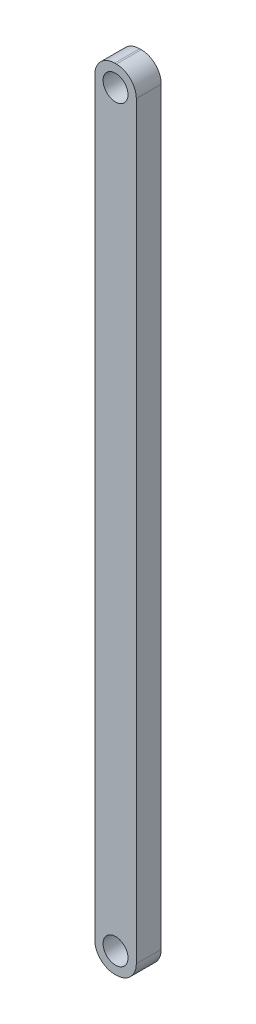
ISO-10303-21;
HEADER;
FILE_DESCRIPTION(('STEP AP214'),'2;1');
FILE_NAME('part.step','',(''),(''),'','','');
FILE_SCHEMA(('AUTOMOTIVE_DESIGN { 1 0 10303 214 1 1 1 1 }'));
ENDSEC;
DATA;
#1=APPLICATION_CONTEXT('core data for automotive mechanical design processes');
#2=APPLICATION_PROTOCOL_DEFINITION('international standard','automotive_design',2000,#1);
#3=PRODUCT_CONTEXT('',#1,'mechanical');
#4=PRODUCT('Part','Part','',(#3));
#5=PRODUCT_RELATED_PRODUCT_CATEGORY('part','',(#4));
#6=PRODUCT_DEFINITION_FORMATION('','',#4);
#7=PRODUCT_DEFINITION_CONTEXT('part definition',#1,'design');
#8=PRODUCT_DEFINITION('design','',#6,#7);
#9=PRODUCT_DEFINITION_SHAPE('','',#8);
#10=(LENGTH_UNIT() NAMED_UNIT(*) SI_UNIT(.MILLI.,.METRE.));
#11=(NAMED_UNIT(*) PLANE_ANGLE_UNIT() SI_UNIT($,.RADIAN.));
#12=(NAMED_UNIT(*) SI_UNIT($,.STERADIAN.) SOLID_ANGLE_UNIT());
#13=UNCERTAINTY_MEASURE_WITH_UNIT(LENGTH_MEASURE(1.E-05),#10,'distance_accuracy_value','');
#14=(GEOMETRIC_REPRESENTATION_CONTEXT(3) GLOBAL_UNCERTAINTY_ASSIGNED_CONTEXT((#13)) GLOBAL_UNIT_ASSIGNED_CONTEXT((#10,
#11,#12)) REPRESENTATION_CONTEXT('',''));
#15=CARTESIAN_POINT('',(0.,0.,0.));
#16=DIRECTION('',(0.,0.,1.));
#17=DIRECTION('',(1.,0.,0.));
#18=AXIS2_PLACEMENT_3D('',#15,#16,#17);
#19=CARTESIAN_POINT('',(0.,120.65,3.81));
#20=DIRECTION('',(1.,0.,0.));
#21=DIRECTION('',(0.,1.,0.));
#22=AXIS2_PLACEMENT_3D('',#19,#20,#21);
#23=PLANE('',#22);
#24=DIRECTION('',(0.,-1.,0.));
#25=VECTOR('',#24,1.);
#26=CARTESIAN_POINT('',(0.,120.65,0.));
#27=LINE('',#26,#25);
#28=CARTESIAN_POINT('',(0.,117.602,0.));
#29=VERTEX_POINT('',#28);
#30=CARTESIAN_POINT('',(0.,3.04800000000002,0.));
#31=VERTEX_POINT('',#30);
#32=EDGE_CURVE('E190',#29,#31,#27,.T.);
#33=ORIENTED_EDGE('',*,*,#32,.T.);
#34=DIRECTION('',(0.,0.,-1.));
#35=VECTOR('',#34,1.);
#36=CARTESIAN_POINT('',(0.,3.048,3.81));
#37=LINE('',#36,#35);
#38=CARTESIAN_POINT('',(0.,3.04800000000002,3.81));
#39=VERTEX_POINT('',#38);
#40=EDGE_CURVE('E48',#31,#39,#37,.F.);
#41=ORIENTED_EDGE('',*,*,#40,.T.);
#42=DIRECTION('',(0.,-1.,0.));
#43=VECTOR('',#42,1.);
#44=CARTESIAN_POINT('',(0.,120.65,3.81));
#45=LINE('',#44,#43);
#46=CARTESIAN_POINT('',(0.,117.602,3.81));
#47=VERTEX_POINT('',#46);
#48=EDGE_CURVE('E130',#47,#39,#45,.T.);
#49=ORIENTED_EDGE('',*,*,#48,.F.);
#50=DIRECTION('',(0.,0.,-1.));
#51=VECTOR('',#50,1.);
#52=CARTESIAN_POINT('',(0.,117.602,3.81));
#53=LINE('',#52,#51);
#54=EDGE_CURVE('E146',#47,#29,#53,.T.);
#55=ORIENTED_EDGE('',*,*,#54,.T.);
#56=EDGE_LOOP('',(#33,#41,#49,#55));
#57=FACE_BOUND('',#56,.T.);
#58=ADVANCED_FACE('F39',(#57),#23,.F.);
#59=CARTESIAN_POINT('',(0.,0.,3.81));
#60=DIRECTION('',(0.,1.,0.));
#61=DIRECTION('',(0.,0.,1.));
#62=AXIS2_PLACEMENT_3D('',#59,#60,#61);
#63=PLANE('',#62);
#64=DIRECTION('',(1.,0.,0.));
#65=VECTOR('',#64,1.);
#66=CARTESIAN_POINT('',(0.,0.,3.81));
#67=LINE('',#66,#65);
#68=CARTESIAN_POINT('',(3.048,0.,3.81));
#69=VERTEX_POINT('',#68);
#70=CARTESIAN_POINT('',(3.30199999999999,0.,3.81));
#71=VERTEX_POINT('',#70);
#72=EDGE_CURVE('E135',#69,#71,#67,.T.);
#73=ORIENTED_EDGE('',*,*,#72,.F.);
#74=DIRECTION('',(0.,0.,-1.));
#75=VECTOR('',#74,1.);
#76=CARTESIAN_POINT('',(3.048,0.,3.81));
#77=LINE('',#76,#75);
#78=CARTESIAN_POINT('',(3.048,0.,0.));
#79=VERTEX_POINT('',#78);
#80=EDGE_CURVE('E173',#69,#79,#77,.T.);
#81=ORIENTED_EDGE('',*,*,#80,.T.);
#82=DIRECTION('',(1.,0.,0.));
#83=VECTOR('',#82,1.);
#84=CARTESIAN_POINT('',(0.,0.,0.));
#85=LINE('',#84,#83);
#86=CARTESIAN_POINT('',(3.30199999999999,0.,0.));
#87=VERTEX_POINT('',#86);
#88=EDGE_CURVE('E137',#79,#87,#85,.T.);
#89=ORIENTED_EDGE('',*,*,#88,.T.);
#90=DIRECTION('',(0.,0.,-1.));
#91=VECTOR('',#90,1.);
#92=CARTESIAN_POINT('',(3.30199999999999,0.,3.81));
#93=LINE('',#92,#91);
#94=EDGE_CURVE('E166',#87,#71,#93,.F.);
#95=ORIENTED_EDGE('',*,*,#94,.T.);
#96=EDGE_LOOP('',(#73,#81,#89,#95));
#97=FACE_BOUND('',#96,.T.);
#98=ADVANCED_FACE('F195',(#97),#63,.F.);
#99=CARTESIAN_POINT('',(6.34999999999998,120.65,3.81));
#100=DIRECTION('',(-1.,0.,0.));
#101=DIRECTION('',(0.,-1.,0.));
#102=AXIS2_PLACEMENT_3D('',#99,#100,#101);
#103=PLANE('',#102);
#104=DIRECTION('',(0.,1.,0.));
#105=VECTOR('',#104,1.);
#106=CARTESIAN_POINT('',(6.34999999999998,120.65,3.81));
#107=LINE('',#106,#105);
#108=CARTESIAN_POINT('',(6.34999999999999,3.04800000000002,3.81));
#109=VERTEX_POINT('',#108);
#110=CARTESIAN_POINT('',(6.34999999999998,117.602,3.81));
#111=VERTEX_POINT('',#110);
#112=EDGE_CURVE('E181',#109,#111,#107,.T.);
#113=ORIENTED_EDGE('',*,*,#112,.F.);
#114=DIRECTION('',(0.,0.,-1.));
#115=VECTOR('',#114,1.);
#116=CARTESIAN_POINT('',(6.34999999999999,3.048,3.81));
#117=LINE('',#116,#115);
#118=CARTESIAN_POINT('',(6.34999999999999,3.04800000000002,0.));
#119=VERTEX_POINT('',#118);
#120=EDGE_CURVE('E158',#109,#119,#117,.T.);
#121=ORIENTED_EDGE('',*,*,#120,.T.);
#122=DIRECTION('',(0.,1.,0.));
#123=VECTOR('',#122,1.);
#124=CARTESIAN_POINT('',(6.34999999999998,120.65,0.));
#125=LINE('',#124,#123);
#126=CARTESIAN_POINT('',(6.34999999999998,117.602,0.));
#127=VERTEX_POINT('',#126);
#128=EDGE_CURVE('E131',#119,#127,#125,.T.);
#129=ORIENTED_EDGE('',*,*,#128,.T.);
#130=DIRECTION('',(0.,0.,-1.));
#131=VECTOR('',#130,1.);
#132=CARTESIAN_POINT('',(6.34999999999998,117.602,3.81));
#133=LINE('',#132,#131);
#134=EDGE_CURVE('E112',#127,#111,#133,.F.);
#135=ORIENTED_EDGE('',*,*,#134,.T.);
#136=EDGE_LOOP('',(#113,#121,#129,#135));
#137=FACE_BOUND('',#136,.T.);
#138=ADVANCED_FACE('F205',(#137),#103,.F.);
#139=CARTESIAN_POINT('',(0.,120.65,3.81));
#140=DIRECTION('',(0.,-1.,0.));
#141=DIRECTION('',(0.,0.,-1.));
#142=AXIS2_PLACEMENT_3D('',#139,#140,#141);
#143=PLANE('',#142);
#144=DIRECTION('',(-1.,0.,0.));
#145=VECTOR('',#144,1.);
#146=CARTESIAN_POINT('',(0.,120.65,0.));
#147=LINE('',#146,#145);
#148=CARTESIAN_POINT('',(3.30199999999998,120.65,0.));
#149=VERTEX_POINT('',#148);
#150=CARTESIAN_POINT('',(3.04799999999998,120.65,0.));
#151=VERTEX_POINT('',#150);
#152=EDGE_CURVE('E121',#149,#151,#147,.T.);
#153=ORIENTED_EDGE('',*,*,#152,.T.);
#154=DIRECTION('',(0.,0.,-1.));
#155=VECTOR('',#154,1.);
#156=CARTESIAN_POINT('',(3.04799999999998,120.65,3.81));
#157=LINE('',#156,#155);
#158=CARTESIAN_POINT('',(3.04799999999998,120.65,3.81));
#159=VERTEX_POINT('',#158);
#160=EDGE_CURVE('E152',#151,#159,#157,.F.);
#161=ORIENTED_EDGE('',*,*,#160,.T.);
#162=DIRECTION('',(-1.,0.,0.));
#163=VECTOR('',#162,1.);
#164=CARTESIAN_POINT('',(0.,120.65,3.81));
#165=LINE('',#164,#163);
#166=CARTESIAN_POINT('',(3.30199999999998,120.65,3.81));
#167=VERTEX_POINT('',#166);
#168=EDGE_CURVE('E124',#167,#159,#165,.T.);
#169=ORIENTED_EDGE('',*,*,#168,.F.);
#170=DIRECTION('',(0.,0.,-1.));
#171=VECTOR('',#170,1.);
#172=CARTESIAN_POINT('',(3.30199999999998,120.65,3.81));
#173=LINE('',#172,#171);
#174=EDGE_CURVE('E110',#167,#149,#173,.T.);
#175=ORIENTED_EDGE('',*,*,#174,.T.);
#176=EDGE_LOOP('',(#153,#161,#169,#175));
#177=FACE_BOUND('',#176,.T.);
#178=ADVANCED_FACE('F120',(#177),#143,.F.);
#179=CARTESIAN_POINT('',(0.,0.,3.81));
#180=DIRECTION('',(0.,0.,1.));
#181=DIRECTION('',(1.,0.,0.));
#182=AXIS2_PLACEMENT_3D('',#179,#180,#181);
#183=PLANE('',#182);
#184=CARTESIAN_POINT('',(3.17499999999999,3.175,3.81));
#185=DIRECTION('',(0.,0.,1.));
#186=DIRECTION('',(1.,0.,0.));
#187=AXIS2_PLACEMENT_3D('',#184,#185,#186);
#188=CIRCLE('',#187,1.905);
#189=CARTESIAN_POINT('',(5.07999999999999,3.175,3.81));
#190=VERTEX_POINT('',#189);
#191=EDGE_CURVE('E317',#190,#190,#188,.T.);
#192=ORIENTED_EDGE('',*,*,#191,.F.);
#193=EDGE_LOOP('',(#192));
#194=FACE_BOUND('',#193,.T.);
#195=CARTESIAN_POINT('',(3.17500000000001,117.475,3.81));
#196=DIRECTION('',(0.,0.,1.));
#197=DIRECTION('',(1.,0.,0.));
#198=AXIS2_PLACEMENT_3D('',#195,#196,#197);
#199=CIRCLE('',#198,1.905);
#200=CARTESIAN_POINT('',(5.08000000000001,117.475,3.81));
#201=VERTEX_POINT('',#200);
#202=EDGE_CURVE('E325',#201,#201,#199,.T.);
#203=ORIENTED_EDGE('',*,*,#202,.F.);
#204=EDGE_LOOP('',(#203));
#205=FACE_BOUND('',#204,.T.);
#206=ORIENTED_EDGE('',*,*,#48,.T.);
#207=CARTESIAN_POINT('',(3.048,3.048,3.81));
#208=DIRECTION('',(0.,0.,1.));
#209=DIRECTION('',(1.,0.,0.));
#210=AXIS2_PLACEMENT_3D('',#207,#208,#209);
#211=CIRCLE('',#210,3.048);
#212=EDGE_CURVE('E11',#39,#69,#211,.T.);
#213=ORIENTED_EDGE('',*,*,#212,.T.);
#214=ORIENTED_EDGE('',*,*,#72,.T.);
#215=CARTESIAN_POINT('',(3.30199999999999,3.048,3.81));
#216=DIRECTION('',(0.,0.,1.));
#217=DIRECTION('',(1.,0.,0.));
#218=AXIS2_PLACEMENT_3D('',#215,#216,#217);
#219=CIRCLE('',#218,3.048);
#220=EDGE_CURVE('E170',#71,#109,#219,.T.);
#221=ORIENTED_EDGE('',*,*,#220,.T.);
#222=ORIENTED_EDGE('',*,*,#112,.T.);
#223=CARTESIAN_POINT('',(3.30199999999998,117.602,3.81));
#224=DIRECTION('',(0.,0.,1.));
#225=DIRECTION('',(1.,0.,0.));
#226=AXIS2_PLACEMENT_3D('',#223,#224,#225);
#227=CIRCLE('',#226,3.048);
#228=EDGE_CURVE('E143',#111,#167,#227,.T.);
#229=ORIENTED_EDGE('',*,*,#228,.T.);
#230=ORIENTED_EDGE('',*,*,#168,.T.);
#231=CARTESIAN_POINT('',(3.04799999999998,117.602,3.81));
#232=DIRECTION('',(0.,0.,1.));
#233=DIRECTION('',(1.,0.,0.));
#234=AXIS2_PLACEMENT_3D('',#231,#232,#233);
#235=CIRCLE('',#234,3.048);
#236=EDGE_CURVE('E155',#159,#47,#235,.T.);
#237=ORIENTED_EDGE('',*,*,#236,.T.);
#238=EDGE_LOOP('',(#206,#213,#214,#221,#222,#229,#230,#237));
#239=FACE_BOUND('',#238,.T.);
#240=ADVANCED_FACE('F203',(#194,#205,#239),#183,.T.);
#241=CARTESIAN_POINT('',(0.,0.,0.));
#242=DIRECTION('',(0.,0.,1.));
#243=DIRECTION('',(1.,0.,0.));
#244=AXIS2_PLACEMENT_3D('',#241,#242,#243);
#245=PLANE('',#244);
#246=CARTESIAN_POINT('',(3.17499999999999,3.175,0.));
#247=DIRECTION('',(0.,0.,1.));
#248=DIRECTION('',(1.,0.,0.));
#249=AXIS2_PLACEMENT_3D('',#246,#247,#248);
#250=CIRCLE('',#249,1.905);
#251=CARTESIAN_POINT('',(5.07999999999999,3.175,0.));
#252=VERTEX_POINT('',#251);
#253=EDGE_CURVE('E192',#252,#252,#250,.T.);
#254=ORIENTED_EDGE('',*,*,#253,.T.);
#255=EDGE_LOOP('',(#254));
#256=FACE_BOUND('',#255,.T.);
#257=CARTESIAN_POINT('',(3.17500000000001,117.475,0.));
#258=DIRECTION('',(0.,0.,1.));
#259=DIRECTION('',(1.,0.,0.));
#260=AXIS2_PLACEMENT_3D('',#257,#258,#259);
#261=CIRCLE('',#260,1.905);
#262=CARTESIAN_POINT('',(5.08000000000001,117.475,0.));
#263=VERTEX_POINT('',#262);
#264=EDGE_CURVE('E319',#263,#263,#261,.T.);
#265=ORIENTED_EDGE('',*,*,#264,.T.);
#266=EDGE_LOOP('',(#265));
#267=FACE_BOUND('',#266,.T.);
#268=ORIENTED_EDGE('',*,*,#88,.F.);
#269=CARTESIAN_POINT('',(3.048,3.048,0.));
#270=DIRECTION('',(0.,0.,1.));
#271=DIRECTION('',(1.,0.,0.));
#272=AXIS2_PLACEMENT_3D('',#269,#270,#271);
#273=CIRCLE('',#272,3.048);
#274=EDGE_CURVE('E62',#79,#31,#273,.F.);
#275=ORIENTED_EDGE('',*,*,#274,.T.);
#276=ORIENTED_EDGE('',*,*,#32,.F.);
#277=CARTESIAN_POINT('',(3.04799999999998,117.602,0.));
#278=DIRECTION('',(0.,0.,1.));
#279=DIRECTION('',(1.,0.,0.));
#280=AXIS2_PLACEMENT_3D('',#277,#278,#279);
#281=CIRCLE('',#280,3.048);
#282=EDGE_CURVE('E128',#29,#151,#281,.F.);
#283=ORIENTED_EDGE('',*,*,#282,.T.);
#284=ORIENTED_EDGE('',*,*,#152,.F.);
#285=CARTESIAN_POINT('',(3.30199999999998,117.602,0.));
#286=DIRECTION('',(0.,0.,1.));
#287=DIRECTION('',(1.,0.,0.));
#288=AXIS2_PLACEMENT_3D('',#285,#286,#287);
#289=CIRCLE('',#288,3.048);
#290=EDGE_CURVE('E106',#149,#127,#289,.F.);
#291=ORIENTED_EDGE('',*,*,#290,.T.);
#292=ORIENTED_EDGE('',*,*,#128,.F.);
#293=CARTESIAN_POINT('',(3.30199999999999,3.048,0.));
#294=DIRECTION('',(0.,0.,1.));
#295=DIRECTION('',(1.,0.,0.));
#296=AXIS2_PLACEMENT_3D('',#293,#294,#295);
#297=CIRCLE('',#296,3.048);
#298=EDGE_CURVE('E162',#119,#87,#297,.F.);
#299=ORIENTED_EDGE('',*,*,#298,.T.);
#300=EDGE_LOOP('',(#268,#275,#276,#283,#284,#291,#292,#299));
#301=FACE_BOUND('',#300,.T.);
#302=ADVANCED_FACE('F127',(#256,#267,#301),#245,.F.);
#303=CARTESIAN_POINT('',(3.30199999999998,117.602,3.81));
#304=DIRECTION('',(0.,0.,-1.));
#305=DIRECTION('',(-1.,0.,0.));
#306=AXIS2_PLACEMENT_3D('',#303,#304,#305);
#307=CYLINDRICAL_SURFACE('',#306,3.048);
#308=ORIENTED_EDGE('',*,*,#228,.F.);
#309=ORIENTED_EDGE('',*,*,#134,.F.);
#310=ORIENTED_EDGE('',*,*,#290,.F.);
#311=ORIENTED_EDGE('',*,*,#174,.F.);
#312=EDGE_LOOP('',(#308,#309,#310,#311));
#313=FACE_BOUND('',#312,.T.);
#314=ADVANCED_FACE('F109',(#313),#307,.T.);
#315=CARTESIAN_POINT('',(3.04799999999998,117.602,3.81));
#316=DIRECTION('',(0.,0.,-1.));
#317=DIRECTION('',(-1.,0.,0.));
#318=AXIS2_PLACEMENT_3D('',#315,#316,#317);
#319=CYLINDRICAL_SURFACE('',#318,3.048);
#320=ORIENTED_EDGE('',*,*,#236,.F.);
#321=ORIENTED_EDGE('',*,*,#160,.F.);
#322=ORIENTED_EDGE('',*,*,#282,.F.);
#323=ORIENTED_EDGE('',*,*,#54,.F.);
#324=EDGE_LOOP('',(#320,#321,#322,#323));
#325=FACE_BOUND('',#324,.T.);
#326=ADVANCED_FACE('F209',(#325),#319,.T.);
#327=CARTESIAN_POINT('',(3.30199999999999,3.048,3.81));
#328=DIRECTION('',(0.,0.,-1.));
#329=DIRECTION('',(-1.,0.,0.));
#330=AXIS2_PLACEMENT_3D('',#327,#328,#329);
#331=CYLINDRICAL_SURFACE('',#330,3.048);
#332=ORIENTED_EDGE('',*,*,#220,.F.);
#333=ORIENTED_EDGE('',*,*,#94,.F.);
#334=ORIENTED_EDGE('',*,*,#298,.F.);
#335=ORIENTED_EDGE('',*,*,#120,.F.);
#336=EDGE_LOOP('',(#332,#333,#334,#335));
#337=FACE_BOUND('',#336,.T.);
#338=ADVANCED_FACE('F201',(#337),#331,.T.);
#339=CARTESIAN_POINT('',(3.048,3.048,3.81));
#340=DIRECTION('',(0.,0.,-1.));
#341=DIRECTION('',(-1.,0.,0.));
#342=AXIS2_PLACEMENT_3D('',#339,#340,#341);
#343=CYLINDRICAL_SURFACE('',#342,3.048);
#344=ORIENTED_EDGE('',*,*,#212,.F.);
#345=ORIENTED_EDGE('',*,*,#40,.F.);
#346=ORIENTED_EDGE('',*,*,#274,.F.);
#347=ORIENTED_EDGE('',*,*,#80,.F.);
#348=EDGE_LOOP('',(#344,#345,#346,#347));
#349=FACE_BOUND('',#348,.T.);
#350=ADVANCED_FACE('F41',(#349),#343,.T.);
#351=CARTESIAN_POINT('',(3.17500000000001,117.475,0.));
#352=DIRECTION('',(0.,0.,1.));
#353=DIRECTION('',(1.,0.,0.));
#354=AXIS2_PLACEMENT_3D('',#351,#352,#353);
#355=CYLINDRICAL_SURFACE('',#354,1.905);
#356=CARTESIAN_POINT('',(5.08000000000001,117.475,0.));
#357=CARTESIAN_POINT('',(5.08000000000001,117.475,0.0396874999999999));
#358=CARTESIAN_POINT('',(5.08000000000001,117.475,0.079375));
#359=CARTESIAN_POINT('',(5.08000000000001,117.475,0.15875));
#360=CARTESIAN_POINT('',(5.08000000000001,117.475,0.1984375));
#361=CARTESIAN_POINT('',(5.08000000000001,117.475,0.2778125));
#362=CARTESIAN_POINT('',(5.08000000000001,117.475,0.3175));
#363=CARTESIAN_POINT('',(5.08000000000001,117.475,0.396875));
#364=CARTESIAN_POINT('',(5.08000000000001,117.475,0.4365625));
#365=CARTESIAN_POINT('',(5.08000000000001,117.475,0.5159375));
#366=CARTESIAN_POINT('',(5.08000000000001,117.475,0.555625));
#367=CARTESIAN_POINT('',(5.08000000000001,117.475,0.635));
#368=CARTESIAN_POINT('',(5.08000000000001,117.475,0.6746875));
#369=CARTESIAN_POINT('',(5.08000000000001,117.475,0.7540625));
#370=CARTESIAN_POINT('',(5.08000000000001,117.475,0.79375));
#371=CARTESIAN_POINT('',(5.08000000000001,117.475,0.873125));
#372=CARTESIAN_POINT('',(5.08000000000001,117.475,0.9128125));
#373=CARTESIAN_POINT('',(5.08000000000001,117.475,0.9921875));
#374=CARTESIAN_POINT('',(5.08000000000001,117.475,1.031875));
#375=CARTESIAN_POINT('',(5.08000000000001,117.475,1.11125));
#376=CARTESIAN_POINT('',(5.08000000000001,117.475,1.1509375));
#377=CARTESIAN_POINT('',(5.08000000000001,117.475,1.2303125));
#378=CARTESIAN_POINT('',(5.08000000000001,117.475,1.27));
#379=CARTESIAN_POINT('',(5.08000000000001,117.475,1.349375));
#380=CARTESIAN_POINT('',(5.08000000000001,117.475,1.3890625));
#381=CARTESIAN_POINT('',(5.08000000000001,117.475,1.4684375));
#382=CARTESIAN_POINT('',(5.08000000000001,117.475,1.508125));
#383=CARTESIAN_POINT('',(5.08000000000001,117.475,1.5875));
#384=CARTESIAN_POINT('',(5.08000000000001,117.475,1.6271875));
#385=CARTESIAN_POINT('',(5.08000000000001,117.475,1.7065625));
#386=CARTESIAN_POINT('',(5.08000000000001,117.475,1.74625));
#387=CARTESIAN_POINT('',(5.08000000000001,117.475,1.825625));
#388=CARTESIAN_POINT('',(5.08000000000001,117.475,1.8653125));
#389=CARTESIAN_POINT('',(5.08000000000001,117.475,1.9446875));
#390=CARTESIAN_POINT('',(5.08000000000001,117.475,1.984375));
#391=CARTESIAN_POINT('',(5.08000000000001,117.475,2.06375));
#392=CARTESIAN_POINT('',(5.08000000000001,117.475,2.1034375));
#393=CARTESIAN_POINT('',(5.08000000000001,117.475,2.1828125));
#394=CARTESIAN_POINT('',(5.08000000000001,117.475,2.2225));
#395=CARTESIAN_POINT('',(5.08000000000001,117.475,2.301875));
#396=CARTESIAN_POINT('',(5.08000000000001,117.475,2.3415625));
#397=CARTESIAN_POINT('',(5.08000000000001,117.475,2.4209375));
#398=CARTESIAN_POINT('',(5.08000000000001,117.475,2.460625));
#399=CARTESIAN_POINT('',(5.08000000000001,117.475,2.54));
#400=CARTESIAN_POINT('',(5.08000000000001,117.475,2.5796875));
#401=CARTESIAN_POINT('',(5.08000000000001,117.475,2.6590625));
#402=CARTESIAN_POINT('',(5.08000000000001,117.475,2.69875));
#403=CARTESIAN_POINT('',(5.08000000000001,117.475,2.778125));
#404=CARTESIAN_POINT('',(5.08000000000001,117.475,2.8178125));
#405=CARTESIAN_POINT('',(5.08000000000001,117.475,2.8971875));
#406=CARTESIAN_POINT('',(5.08000000000001,117.475,2.936875));
#407=CARTESIAN_POINT('',(5.08000000000001,117.475,3.01625));
#408=CARTESIAN_POINT('',(5.08000000000001,117.475,3.0559375));
#409=CARTESIAN_POINT('',(5.08000000000001,117.475,3.1353125));
#410=CARTESIAN_POINT('',(5.08000000000001,117.475,3.175));
#411=CARTESIAN_POINT('',(5.08000000000001,117.475,3.254375));
#412=CARTESIAN_POINT('',(5.08000000000001,117.475,3.2940625));
#413=CARTESIAN_POINT('',(5.08000000000001,117.475,3.3734375));
#414=CARTESIAN_POINT('',(5.08000000000001,117.475,3.413125));
#415=CARTESIAN_POINT('',(5.08000000000001,117.475,3.4925));
#416=CARTESIAN_POINT('',(5.08000000000001,117.475,3.5321875));
#417=CARTESIAN_POINT('',(5.08000000000001,117.475,3.6115625));
#418=CARTESIAN_POINT('',(5.08000000000001,117.475,3.65125));
#419=CARTESIAN_POINT('',(5.08000000000001,117.475,3.730625));
#420=CARTESIAN_POINT('',(5.08000000000001,117.475,3.7703125));
#421=CARTESIAN_POINT('',(5.08000000000001,117.475,3.81));
#422=B_SPLINE_CURVE_WITH_KNOTS('',3,(#356,#357,#358,#359,#360,#361,#362,#363,#364,#365,#366,
#367,#368,#369,#370,#371,#372,#373,#374,#375,#376,#377,#378,#379,#380,#381,#382,#383,#384,#385,
#386,#387,#388,#389,#390,#391,#392,#393,#394,#395,#396,#397,#398,#399,#400,#401,#402,#403,#404,
#405,#406,#407,#408,#409,#410,#411,#412,#413,#414,#415,#416,#417,#418,#419,#420,#421),
.UNSPECIFIED.,.F.,.F.,(4,2,2,2,2,2,2,2,2,2,2,2,2,2,2,2,2,2,2,2,2,2,2,2,2,2,2,2,2,2,2,2,4),(0.,
0.1190625,0.238125,0.3571875,0.47625,0.5953125,0.714375,0.8334375,0.9525,1.0715625,1.190625,
1.3096875,1.42875,1.5478125,1.666875,1.7859375,1.905,2.0240625,2.143125,2.2621875,2.38125,
2.5003125,2.619375,2.7384375,2.8575,2.9765625,3.095625,3.2146875,3.33375,3.4528125,3.571875,
3.6909375,3.81),.UNSPECIFIED.);
#423=EDGE_CURVE('BSEAM213',#263,#201,#422,.T.);
#424=ORIENTED_EDGE('',*,*,#264,.F.);
#425=ORIENTED_EDGE('',*,*,#202,.T.);
#426=ORIENTED_EDGE('',*,*,#423,.T.);
#427=ORIENTED_EDGE('',*,*,#423,.F.);
#428=EDGE_LOOP('',(#424,#426,#425,#427));
#429=FACE_BOUND('',#428,.T.);
#430=ADVANCED_FACE('F213',(#429),#355,.F.);
#431=CARTESIAN_POINT('',(3.17499999999999,3.175,0.));
#432=DIRECTION('',(0.,0.,1.));
#433=DIRECTION('',(1.,0.,0.));
#434=AXIS2_PLACEMENT_3D('',#431,#432,#433);
#435=CYLINDRICAL_SURFACE('',#434,1.905);
#436=CARTESIAN_POINT('',(5.07999999999999,3.175,0.));
#437=CARTESIAN_POINT('',(5.07999999999999,3.175,0.0396874999999999));
#438=CARTESIAN_POINT('',(5.07999999999999,3.175,0.079375));
#439=CARTESIAN_POINT('',(5.07999999999999,3.175,0.15875));
#440=CARTESIAN_POINT('',(5.07999999999999,3.175,0.1984375));
#441=CARTESIAN_POINT('',(5.07999999999999,3.175,0.2778125));
#442=CARTESIAN_POINT('',(5.07999999999999,3.175,0.3175));
#443=CARTESIAN_POINT('',(5.07999999999999,3.175,0.396875));
#444=CARTESIAN_POINT('',(5.07999999999999,3.175,0.4365625));
#445=CARTESIAN_POINT('',(5.07999999999999,3.175,0.5159375));
#446=CARTESIAN_POINT('',(5.07999999999999,3.175,0.555625));
#447=CARTESIAN_POINT('',(5.07999999999999,3.175,0.635));
#448=CARTESIAN_POINT('',(5.07999999999999,3.175,0.6746875));
#449=CARTESIAN_POINT('',(5.07999999999999,3.175,0.7540625));
#450=CARTESIAN_POINT('',(5.07999999999999,3.175,0.79375));
#451=CARTESIAN_POINT('',(5.07999999999999,3.175,0.873125));
#452=CARTESIAN_POINT('',(5.07999999999999,3.175,0.9128125));
#453=CARTESIAN_POINT('',(5.07999999999999,3.175,0.9921875));
#454=CARTESIAN_POINT('',(5.07999999999999,3.175,1.031875));
#455=CARTESIAN_POINT('',(5.07999999999999,3.175,1.11125));
#456=CARTESIAN_POINT('',(5.07999999999999,3.175,1.1509375));
#457=CARTESIAN_POINT('',(5.07999999999999,3.175,1.2303125));
#458=CARTESIAN_POINT('',(5.07999999999999,3.175,1.27));
#459=CARTESIAN_POINT('',(5.07999999999999,3.175,1.349375));
#460=CARTESIAN_POINT('',(5.07999999999999,3.175,1.3890625));
#461=CARTESIAN_POINT('',(5.07999999999999,3.175,1.4684375));
#462=CARTESIAN_POINT('',(5.07999999999999,3.175,1.508125));
#463=CARTESIAN_POINT('',(5.07999999999999,3.175,1.5875));
#464=CARTESIAN_POINT('',(5.07999999999999,3.175,1.6271875));
#465=CARTESIAN_POINT('',(5.07999999999999,3.175,1.7065625));
#466=CARTESIAN_POINT('',(5.07999999999999,3.175,1.74625));
#467=CARTESIAN_POINT('',(5.07999999999999,3.175,1.825625));
#468=CARTESIAN_POINT('',(5.07999999999999,3.175,1.8653125));
#469=CARTESIAN_POINT('',(5.07999999999999,3.175,1.9446875));
#470=CARTESIAN_POINT('',(5.07999999999999,3.175,1.984375));
#471=CARTESIAN_POINT('',(5.07999999999999,3.175,2.06375));
#472=CARTESIAN_POINT('',(5.07999999999999,3.175,2.1034375));
#473=CARTESIAN_POINT('',(5.07999999999999,3.175,2.1828125));
#474=CARTESIAN_POINT('',(5.07999999999999,3.175,2.2225));
#475=CARTESIAN_POINT('',(5.07999999999999,3.175,2.301875));
#476=CARTESIAN_POINT('',(5.07999999999999,3.175,2.3415625));
#477=CARTESIAN_POINT('',(5.07999999999999,3.175,2.4209375));
#478=CARTESIAN_POINT('',(5.07999999999999,3.175,2.460625));
#479=CARTESIAN_POINT('',(5.07999999999999,3.175,2.54));
#480=CARTESIAN_POINT('',(5.07999999999999,3.175,2.5796875));
#481=CARTESIAN_POINT('',(5.07999999999999,3.175,2.6590625));
#482=CARTESIAN_POINT('',(5.07999999999999,3.175,2.69875));
#483=CARTESIAN_POINT('',(5.07999999999999,3.175,2.778125));
#484=CARTESIAN_POINT('',(5.07999999999999,3.175,2.8178125));
#485=CARTESIAN_POINT('',(5.07999999999999,3.175,2.8971875));
#486=CARTESIAN_POINT('',(5.07999999999999,3.175,2.936875));
#487=CARTESIAN_POINT('',(5.07999999999999,3.175,3.01625));
#488=CARTESIAN_POINT('',(5.07999999999999,3.175,3.0559375));
#489=CARTESIAN_POINT('',(5.07999999999999,3.175,3.1353125));
#490=CARTESIAN_POINT('',(5.07999999999999,3.175,3.175));
#491=CARTESIAN_POINT('',(5.07999999999999,3.175,3.254375));
#492=CARTESIAN_POINT('',(5.07999999999999,3.175,3.2940625));
#493=CARTESIAN_POINT('',(5.07999999999999,3.175,3.3734375));
#494=CARTESIAN_POINT('',(5.07999999999999,3.175,3.413125));
#495=CARTESIAN_POINT('',(5.07999999999999,3.175,3.4925));
#496=CARTESIAN_POINT('',(5.07999999999999,3.175,3.5321875));
#497=CARTESIAN_POINT('',(5.07999999999999,3.175,3.6115625));
#498=CARTESIAN_POINT('',(5.07999999999999,3.175,3.65125));
#499=CARTESIAN_POINT('',(5.07999999999999,3.175,3.730625));
#500=CARTESIAN_POINT('',(5.07999999999999,3.175,3.7703125));
#501=CARTESIAN_POINT('',(5.07999999999999,3.175,3.81));
#502=B_SPLINE_CURVE_WITH_KNOTS('',3,(#436,#437,#438,#439,#440,#441,#442,#443,#444,#445,#446,
#447,#448,#449,#450,#451,#452,#453,#454,#455,#456,#457,#458,#459,#460,#461,#462,#463,#464,#465,
#466,#467,#468,#469,#470,#471,#472,#473,#474,#475,#476,#477,#478,#479,#480,#481,#482,#483,#484,
#485,#486,#487,#488,#489,#490,#491,#492,#493,#494,#495,#496,#497,#498,#499,#500,#501),
.UNSPECIFIED.,.F.,.F.,(4,2,2,2,2,2,2,2,2,2,2,2,2,2,2,2,2,2,2,2,2,2,2,2,2,2,2,2,2,2,2,2,4),(0.,
0.1190625,0.238125,0.3571875,0.47625,0.5953125,0.714375,0.8334375,0.9525,1.0715625,1.190625,
1.3096875,1.42875,1.5478125,1.666875,1.7859375,1.905,2.0240625,2.143125,2.2621875,2.38125,
2.5003125,2.619375,2.7384375,2.8575,2.9765625,3.095625,3.2146875,3.33375,3.4528125,3.571875,
3.6909375,3.81),.UNSPECIFIED.);
#503=EDGE_CURVE('BSEAM218',#252,#190,#502,.T.);
#504=ORIENTED_EDGE('',*,*,#253,.F.);
#505=ORIENTED_EDGE('',*,*,#191,.T.);
#506=ORIENTED_EDGE('',*,*,#503,.T.);
#507=ORIENTED_EDGE('',*,*,#503,.F.);
#508=EDGE_LOOP('',(#504,#506,#505,#507));
#509=FACE_BOUND('',#508,.T.);
#510=ADVANCED_FACE('F218',(#509),#435,.F.);
#511=CLOSED_SHELL('',(#58,#98,#138,#178,#240,#302,#314,#326,#338,#350,#430,#510));
#512=MANIFOLD_SOLID_BREP('B2',#511);
#513=ADVANCED_BREP_SHAPE_REPRESENTATION('',(#18,#512),#14);
#514=SHAPE_DEFINITION_REPRESENTATION(#9,#513);
ENDSEC;
END-ISO-10303-21;
